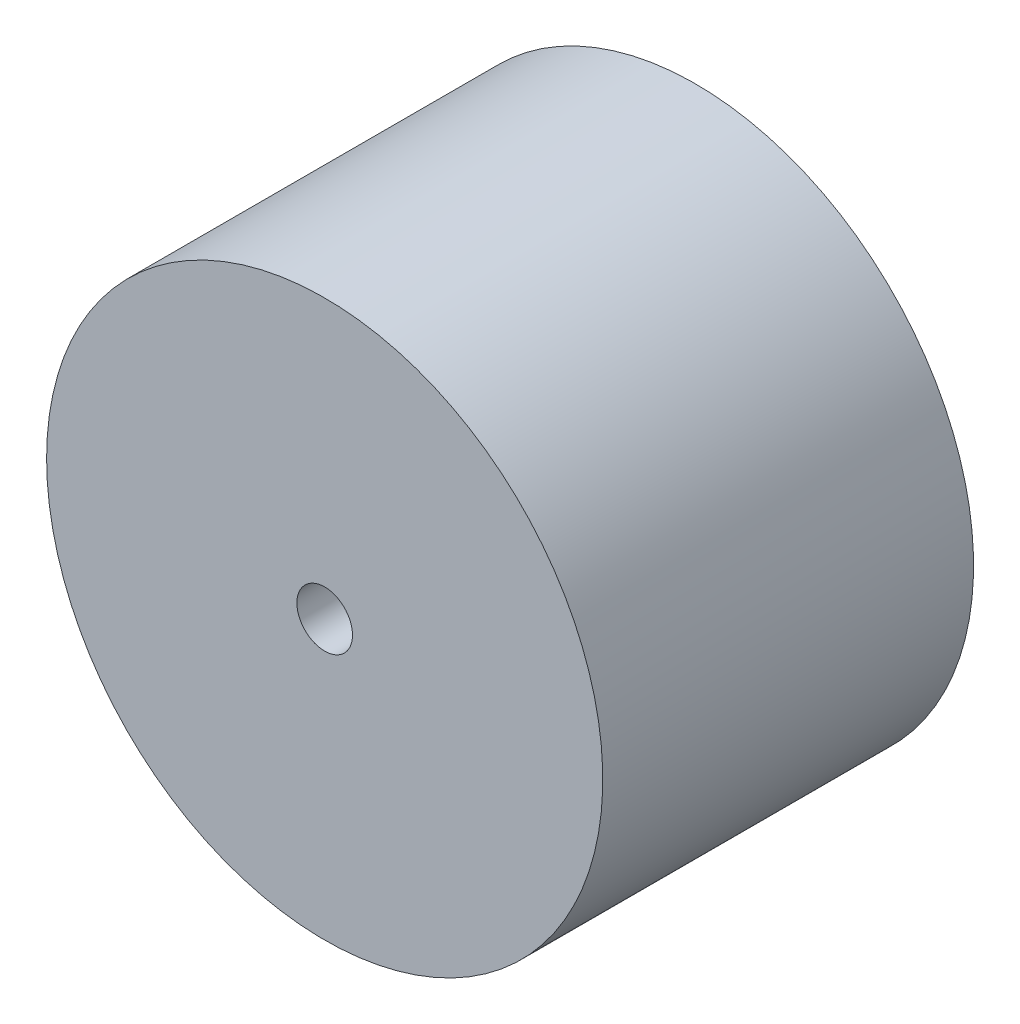
ISO-10303-21;
HEADER;
FILE_DESCRIPTION(('STEP AP214'),'2;1');
FILE_NAME('part.step','',(''),(''),'','','');
FILE_SCHEMA(('AUTOMOTIVE_DESIGN { 1 0 10303 214 1 1 1 1 }'));
ENDSEC;
DATA;
#1=APPLICATION_CONTEXT('core data for automotive mechanical design processes');
#2=APPLICATION_PROTOCOL_DEFINITION('international standard','automotive_design',2000,#1);
#3=PRODUCT_CONTEXT('',#1,'mechanical');
#4=PRODUCT('Part','Part','',(#3));
#5=PRODUCT_RELATED_PRODUCT_CATEGORY('part','',(#4));
#6=PRODUCT_DEFINITION_FORMATION('','',#4);
#7=PRODUCT_DEFINITION_CONTEXT('part definition',#1,'design');
#8=PRODUCT_DEFINITION('design','',#6,#7);
#9=PRODUCT_DEFINITION_SHAPE('','',#8);
#10=(LENGTH_UNIT() NAMED_UNIT(*) SI_UNIT(.MILLI.,.METRE.));
#11=(NAMED_UNIT(*) PLANE_ANGLE_UNIT() SI_UNIT($,.RADIAN.));
#12=(NAMED_UNIT(*) SI_UNIT($,.STERADIAN.) SOLID_ANGLE_UNIT());
#13=UNCERTAINTY_MEASURE_WITH_UNIT(LENGTH_MEASURE(1.E-05),#10,'distance_accuracy_value','');
#14=(GEOMETRIC_REPRESENTATION_CONTEXT(3) GLOBAL_UNCERTAINTY_ASSIGNED_CONTEXT((#13)) GLOBAL_UNIT_ASSIGNED_CONTEXT((#10,
#11,#12)) REPRESENTATION_CONTEXT('',''));
#15=CARTESIAN_POINT('',(0.,0.,0.));
#16=DIRECTION('',(0.,0.,1.));
#17=DIRECTION('',(1.,0.,0.));
#18=AXIS2_PLACEMENT_3D('',#15,#16,#17);
#19=CARTESIAN_POINT('',(0.,0.,25.));
#20=DIRECTION('',(0.,0.,-1.));
#21=DIRECTION('',(-1.,0.,0.));
#22=AXIS2_PLACEMENT_3D('',#19,#20,#21);
#23=CYLINDRICAL_SURFACE('',#22,1.5);
#24=CARTESIAN_POINT('',(0.,0.,0.));
#25=DIRECTION('',(0.,0.,-1.));
#26=DIRECTION('',(-1.,0.,0.));
#27=AXIS2_PLACEMENT_3D('',#24,#25,#26);
#28=CIRCLE('',#27,1.5);
#29=CARTESIAN_POINT('',(-1.5,0.,0.));
#30=VERTEX_POINT('',#29);
#31=EDGE_CURVE('E186',#30,#30,#28,.T.);
#32=ORIENTED_EDGE('',*,*,#31,.T.);
#33=EDGE_LOOP('',(#32));
#34=FACE_BOUND('',#33,.T.);
#35=CARTESIAN_POINT('',(0.,0.,16.));
#36=DIRECTION('',(0.,0.,1.));
#37=DIRECTION('',(1.,0.,0.));
#38=AXIS2_PLACEMENT_3D('',#35,#36,#37);
#39=CIRCLE('',#38,1.5);
#40=CARTESIAN_POINT('',(1.5,0.,16.));
#41=VERTEX_POINT('',#40);
#42=EDGE_CURVE('E177',#41,#41,#39,.T.);
#43=ORIENTED_EDGE('',*,*,#42,.T.);
#44=EDGE_LOOP('',(#43));
#45=FACE_BOUND('',#44,.T.);
#46=ADVANCED_FACE('F17',(#34,#45),#23,.F.);
#47=CARTESIAN_POINT('',(0.,0.,0.));
#48=DIRECTION('',(0.,0.,-1.));
#49=DIRECTION('',(0.,-1.,0.));
#50=AXIS2_PLACEMENT_3D('',#47,#48,#49);
#51=PLANE('',#50);
#52=CARTESIAN_POINT('',(10.3923048454133,-6.,0.));
#53=DIRECTION('',(0.,0.,-1.));
#54=DIRECTION('',(0.5,-0.866025403784439,0.));
#55=AXIS2_PLACEMENT_3D('',#52,#53,#54);
#56=CIRCLE('',#55,1.625);
#57=CARTESIAN_POINT('',(11.2048048454133,-7.40729128114971,0.));
#58=VERTEX_POINT('',#57);
#59=EDGE_CURVE('E11',#58,#58,#56,.T.);
#60=ORIENTED_EDGE('',*,*,#59,.T.);
#61=EDGE_LOOP('',(#60));
#62=FACE_BOUND('',#61,.T.);
#63=ADVANCED_FACE('F396',(#62),#51,.T.);
#64=CARTESIAN_POINT('',(10.3923048454133,-6.,-119.988123005821));
#65=DIRECTION('',(0.,0.,1.));
#66=DIRECTION('',(1.,0.,0.));
#67=AXIS2_PLACEMENT_3D('',#64,#65,#66);
#68=CYLINDRICAL_SURFACE('',#67,1.625);
#69=CARTESIAN_POINT('',(10.3923048454133,-6.,-4.));
#70=DIRECTION('',(0.,0.,-1.));
#71=DIRECTION('',(1.,0.,0.));
#72=AXIS2_PLACEMENT_3D('',#69,#70,#71);
#73=CIRCLE('',#72,1.625);
#74=CARTESIAN_POINT('',(12.0173048454133,-6.,-4.));
#75=VERTEX_POINT('',#74);
#76=EDGE_CURVE('E150',#75,#75,#73,.T.);
#77=ORIENTED_EDGE('',*,*,#76,.T.);
#78=EDGE_LOOP('',(#77));
#79=FACE_BOUND('',#78,.T.);
#80=ORIENTED_EDGE('',*,*,#59,.F.);
#81=EDGE_LOOP('',(#80));
#82=FACE_BOUND('',#81,.T.);
#83=ADVANCED_FACE('F391',(#79,#82),#68,.F.);
#84=CARTESIAN_POINT('',(0.,0.,0.));
#85=DIRECTION('',(0.,0.,-1.));
#86=DIRECTION('',(0.,-1.,0.));
#87=AXIS2_PLACEMENT_3D('',#84,#85,#86);
#88=PLANE('',#87);
#89=CARTESIAN_POINT('',(6.,-10.3923048454133,0.));
#90=DIRECTION('',(0.,0.,-1.));
#91=DIRECTION('',(0.5,-0.866025403784439,0.));
#92=AXIS2_PLACEMENT_3D('',#89,#90,#91);
#93=CIRCLE('',#92,2.);
#94=CARTESIAN_POINT('',(7.,-12.1243556529821,0.));
#95=VERTEX_POINT('',#94);
#96=EDGE_CURVE('E25',#95,#95,#93,.T.);
#97=ORIENTED_EDGE('',*,*,#96,.T.);
#98=EDGE_LOOP('',(#97));
#99=FACE_BOUND('',#98,.T.);
#100=ADVANCED_FACE('F385',(#99),#88,.T.);
#101=CARTESIAN_POINT('',(6.,-10.3923048454133,-119.988123005821));
#102=DIRECTION('',(0.,0.,1.));
#103=DIRECTION('',(1.,0.,0.));
#104=AXIS2_PLACEMENT_3D('',#101,#102,#103);
#105=CYLINDRICAL_SURFACE('',#104,2.);
#106=CARTESIAN_POINT('',(6.,-10.3923048454133,-4.));
#107=DIRECTION('',(0.,0.,-1.));
#108=DIRECTION('',(1.,0.,0.));
#109=AXIS2_PLACEMENT_3D('',#106,#107,#108);
#110=CIRCLE('',#109,2.);
#111=CARTESIAN_POINT('',(8.,-10.3923048454133,-4.));
#112=VERTEX_POINT('',#111);
#113=EDGE_CURVE('E151',#112,#112,#110,.T.);
#114=ORIENTED_EDGE('',*,*,#113,.T.);
#115=EDGE_LOOP('',(#114));
#116=FACE_BOUND('',#115,.T.);
#117=ORIENTED_EDGE('',*,*,#96,.F.);
#118=EDGE_LOOP('',(#117));
#119=FACE_BOUND('',#118,.T.);
#120=ADVANCED_FACE('F373',(#116,#119),#105,.F.);
#121=CARTESIAN_POINT('',(0.,0.,0.));
#122=DIRECTION('',(0.,0.,-1.));
#123=DIRECTION('',(0.,-1.,0.));
#124=AXIS2_PLACEMENT_3D('',#121,#122,#123);
#125=PLANE('',#124);
#126=CARTESIAN_POINT('',(0.,-12.,0.));
#127=DIRECTION('',(0.,0.,-1.));
#128=DIRECTION('',(0.5,-0.866025403784439,0.));
#129=AXIS2_PLACEMENT_3D('',#126,#127,#128);
#130=CIRCLE('',#129,1.625);
#131=CARTESIAN_POINT('',(0.8125,-13.4072912811497,0.));
#132=VERTEX_POINT('',#131);
#133=EDGE_CURVE('E196',#132,#132,#130,.T.);
#134=ORIENTED_EDGE('',*,*,#133,.T.);
#135=EDGE_LOOP('',(#134));
#136=FACE_BOUND('',#135,.T.);
#137=ADVANCED_FACE('F365',(#136),#125,.T.);
#138=CARTESIAN_POINT('',(0.,-12.,-119.988123005821));
#139=DIRECTION('',(0.,0.,1.));
#140=DIRECTION('',(1.,0.,0.));
#141=AXIS2_PLACEMENT_3D('',#138,#139,#140);
#142=CYLINDRICAL_SURFACE('',#141,1.625);
#143=CARTESIAN_POINT('',(0.,-12.,-4.));
#144=DIRECTION('',(0.,0.,-1.));
#145=DIRECTION('',(1.,0.,0.));
#146=AXIS2_PLACEMENT_3D('',#143,#144,#145);
#147=CIRCLE('',#146,1.625);
#148=CARTESIAN_POINT('',(1.625,-12.,-4.));
#149=VERTEX_POINT('',#148);
#150=EDGE_CURVE('E163',#149,#149,#147,.T.);
#151=ORIENTED_EDGE('',*,*,#150,.T.);
#152=EDGE_LOOP('',(#151));
#153=FACE_BOUND('',#152,.T.);
#154=ORIENTED_EDGE('',*,*,#133,.F.);
#155=EDGE_LOOP('',(#154));
#156=FACE_BOUND('',#155,.T.);
#157=ADVANCED_FACE('F354',(#153,#156),#142,.F.);
#158=CARTESIAN_POINT('',(0.,0.,0.));
#159=DIRECTION('',(0.,0.,-1.));
#160=DIRECTION('',(0.,-1.,0.));
#161=AXIS2_PLACEMENT_3D('',#158,#159,#160);
#162=PLANE('',#161);
#163=CARTESIAN_POINT('',(6.,10.3923048454133,0.));
#164=DIRECTION('',(0.,0.,-1.));
#165=DIRECTION('',(0.5,0.866025403784439,0.));
#166=AXIS2_PLACEMENT_3D('',#163,#164,#165);
#167=CIRCLE('',#166,2.);
#168=CARTESIAN_POINT('',(7.,12.1243556529821,0.));
#169=VERTEX_POINT('',#168);
#170=EDGE_CURVE('E193',#169,#169,#167,.T.);
#171=ORIENTED_EDGE('',*,*,#170,.T.);
#172=EDGE_LOOP('',(#171));
#173=FACE_BOUND('',#172,.T.);
#174=ADVANCED_FACE('F335',(#173),#162,.T.);
#175=CARTESIAN_POINT('',(6.,10.3923048454133,-119.988123005821));
#176=DIRECTION('',(0.,0.,1.));
#177=DIRECTION('',(1.,0.,0.));
#178=AXIS2_PLACEMENT_3D('',#175,#176,#177);
#179=CYLINDRICAL_SURFACE('',#178,2.);
#180=CARTESIAN_POINT('',(6.,10.3923048454133,-4.));
#181=DIRECTION('',(0.,0.,-1.));
#182=DIRECTION('',(1.,0.,0.));
#183=AXIS2_PLACEMENT_3D('',#180,#181,#182);
#184=CIRCLE('',#183,2.);
#185=CARTESIAN_POINT('',(8.,10.3923048454133,-4.));
#186=VERTEX_POINT('',#185);
#187=EDGE_CURVE('E129',#186,#186,#184,.T.);
#188=ORIENTED_EDGE('',*,*,#187,.T.);
#189=EDGE_LOOP('',(#188));
#190=FACE_BOUND('',#189,.T.);
#191=ORIENTED_EDGE('',*,*,#170,.F.);
#192=EDGE_LOOP('',(#191));
#193=FACE_BOUND('',#192,.T.);
#194=ADVANCED_FACE('F131',(#190,#193),#179,.F.);
#195=CARTESIAN_POINT('',(0.,0.,0.));
#196=DIRECTION('',(0.,0.,-1.));
#197=DIRECTION('',(0.,-1.,0.));
#198=AXIS2_PLACEMENT_3D('',#195,#196,#197);
#199=PLANE('',#198);
#200=CARTESIAN_POINT('',(10.3923048454133,6.,0.));
#201=DIRECTION('',(0.,0.,-1.));
#202=DIRECTION('',(0.5,0.866025403784439,0.));
#203=AXIS2_PLACEMENT_3D('',#200,#201,#202);
#204=CIRCLE('',#203,1.625);
#205=CARTESIAN_POINT('',(11.2048048454133,7.40729128114971,0.));
#206=VERTEX_POINT('',#205);
#207=EDGE_CURVE('E195',#206,#206,#204,.T.);
#208=ORIENTED_EDGE('',*,*,#207,.T.);
#209=EDGE_LOOP('',(#208));
#210=FACE_BOUND('',#209,.T.);
#211=ADVANCED_FACE('F332',(#210),#199,.T.);
#212=CARTESIAN_POINT('',(10.3923048454133,6.,-119.988123005821));
#213=DIRECTION('',(0.,0.,1.));
#214=DIRECTION('',(1.,0.,0.));
#215=AXIS2_PLACEMENT_3D('',#212,#213,#214);
#216=CYLINDRICAL_SURFACE('',#215,1.625);
#217=CARTESIAN_POINT('',(10.3923048454133,6.,-4.));
#218=DIRECTION('',(0.,0.,-1.));
#219=DIRECTION('',(1.,0.,0.));
#220=AXIS2_PLACEMENT_3D('',#217,#218,#219);
#221=CIRCLE('',#220,1.625);
#222=CARTESIAN_POINT('',(12.0173048454133,6.,-4.));
#223=VERTEX_POINT('',#222);
#224=EDGE_CURVE('E134',#223,#223,#221,.T.);
#225=ORIENTED_EDGE('',*,*,#224,.T.);
#226=EDGE_LOOP('',(#225));
#227=FACE_BOUND('',#226,.T.);
#228=ORIENTED_EDGE('',*,*,#207,.F.);
#229=EDGE_LOOP('',(#228));
#230=FACE_BOUND('',#229,.T.);
#231=ADVANCED_FACE('F272',(#227,#230),#216,.F.);
#232=CARTESIAN_POINT('',(0.,0.,0.));
#233=DIRECTION('',(0.,0.,-1.));
#234=DIRECTION('',(0.,-1.,0.));
#235=AXIS2_PLACEMENT_3D('',#232,#233,#234);
#236=PLANE('',#235);
#237=CARTESIAN_POINT('',(0.,12.,0.));
#238=DIRECTION('',(0.,0.,-1.));
#239=DIRECTION('',(0.5,0.866025403784439,0.));
#240=AXIS2_PLACEMENT_3D('',#237,#238,#239);
#241=CIRCLE('',#240,1.625);
#242=CARTESIAN_POINT('',(0.8125,13.4072912811497,0.));
#243=VERTEX_POINT('',#242);
#244=EDGE_CURVE('E188',#243,#243,#241,.T.);
#245=ORIENTED_EDGE('',*,*,#244,.T.);
#246=EDGE_LOOP('',(#245));
#247=FACE_BOUND('',#246,.T.);
#248=ADVANCED_FACE('F268',(#247),#236,.T.);
#249=CARTESIAN_POINT('',(0.,12.,-119.988123005821));
#250=DIRECTION('',(0.,0.,1.));
#251=DIRECTION('',(1.,0.,0.));
#252=AXIS2_PLACEMENT_3D('',#249,#250,#251);
#253=CYLINDRICAL_SURFACE('',#252,1.625);
#254=CARTESIAN_POINT('',(0.,12.,-4.));
#255=DIRECTION('',(0.,0.,-1.));
#256=DIRECTION('',(1.,0.,0.));
#257=AXIS2_PLACEMENT_3D('',#254,#255,#256);
#258=CIRCLE('',#257,1.625);
#259=CARTESIAN_POINT('',(1.625,12.,-4.));
#260=VERTEX_POINT('',#259);
#261=EDGE_CURVE('E138',#260,#260,#258,.T.);
#262=ORIENTED_EDGE('',*,*,#261,.T.);
#263=EDGE_LOOP('',(#262));
#264=FACE_BOUND('',#263,.T.);
#265=ORIENTED_EDGE('',*,*,#244,.F.);
#266=EDGE_LOOP('',(#265));
#267=FACE_BOUND('',#266,.T.);
#268=ADVANCED_FACE('F238',(#264,#267),#253,.F.);
#269=CARTESIAN_POINT('',(0.,0.,0.));
#270=DIRECTION('',(0.,0.,-1.));
#271=DIRECTION('',(0.,-1.,0.));
#272=AXIS2_PLACEMENT_3D('',#269,#270,#271);
#273=PLANE('',#272);
#274=CARTESIAN_POINT('',(0.,0.,0.));
#275=DIRECTION('',(0.,0.,-1.));
#276=DIRECTION('',(-1.,0.,0.));
#277=AXIS2_PLACEMENT_3D('',#274,#275,#276);
#278=CIRCLE('',#277,6.25);
#279=CARTESIAN_POINT('',(-6.25,0.,0.));
#280=VERTEX_POINT('',#279);
#281=EDGE_CURVE('E158',#280,#280,#278,.T.);
#282=ORIENTED_EDGE('',*,*,#281,.T.);
#283=EDGE_LOOP('',(#282));
#284=FACE_BOUND('',#283,.T.);
#285=ORIENTED_EDGE('',*,*,#31,.F.);
#286=EDGE_LOOP('',(#285));
#287=FACE_BOUND('',#286,.T.);
#288=ADVANCED_FACE('F235',(#284,#287),#273,.T.);
#289=CARTESIAN_POINT('',(0.,0.,-119.988123005821));
#290=DIRECTION('',(0.,0.,1.));
#291=DIRECTION('',(1.,0.,0.));
#292=AXIS2_PLACEMENT_3D('',#289,#290,#291);
#293=CYLINDRICAL_SURFACE('',#292,6.25);
#294=CARTESIAN_POINT('',(0.,0.,-4.));
#295=DIRECTION('',(0.,0.,-1.));
#296=DIRECTION('',(1.,0.,0.));
#297=AXIS2_PLACEMENT_3D('',#294,#295,#296);
#298=CIRCLE('',#297,6.25);
#299=CARTESIAN_POINT('',(6.25,0.,-4.));
#300=VERTEX_POINT('',#299);
#301=EDGE_CURVE('E152',#300,#300,#298,.T.);
#302=ORIENTED_EDGE('',*,*,#301,.T.);
#303=EDGE_LOOP('',(#302));
#304=FACE_BOUND('',#303,.T.);
#305=ORIENTED_EDGE('',*,*,#281,.F.);
#306=EDGE_LOOP('',(#305));
#307=FACE_BOUND('',#306,.T.);
#308=ADVANCED_FACE('F236',(#304,#307),#293,.F.);
#309=CARTESIAN_POINT('',(0.,0.,0.));
#310=DIRECTION('',(0.,0.,-1.));
#311=DIRECTION('',(0.,-1.,0.));
#312=AXIS2_PLACEMENT_3D('',#309,#310,#311);
#313=PLANE('',#312);
#314=CARTESIAN_POINT('',(-10.3923048454133,6.,0.));
#315=DIRECTION('',(0.,0.,-1.));
#316=DIRECTION('',(-1.,0.,0.));
#317=AXIS2_PLACEMENT_3D('',#314,#315,#316);
#318=CIRCLE('',#317,1.625);
#319=CARTESIAN_POINT('',(-12.0173048454133,6.,0.));
#320=VERTEX_POINT('',#319);
#321=EDGE_CURVE('E154',#320,#320,#318,.T.);
#322=ORIENTED_EDGE('',*,*,#321,.T.);
#323=EDGE_LOOP('',(#322));
#324=FACE_BOUND('',#323,.T.);
#325=ADVANCED_FACE('F299',(#324),#313,.T.);
#326=CARTESIAN_POINT('',(-10.3923048454133,6.,-119.988123005821));
#327=DIRECTION('',(0.,0.,1.));
#328=DIRECTION('',(1.,0.,0.));
#329=AXIS2_PLACEMENT_3D('',#326,#327,#328);
#330=CYLINDRICAL_SURFACE('',#329,1.625);
#331=CARTESIAN_POINT('',(-10.3923048454133,6.,-4.));
#332=DIRECTION('',(0.,0.,-1.));
#333=DIRECTION('',(1.,0.,0.));
#334=AXIS2_PLACEMENT_3D('',#331,#332,#333);
#335=CIRCLE('',#334,1.625);
#336=CARTESIAN_POINT('',(-8.76730484541326,6.,-4.));
#337=VERTEX_POINT('',#336);
#338=EDGE_CURVE('E144',#337,#337,#335,.T.);
#339=ORIENTED_EDGE('',*,*,#338,.T.);
#340=EDGE_LOOP('',(#339));
#341=FACE_BOUND('',#340,.T.);
#342=ORIENTED_EDGE('',*,*,#321,.F.);
#343=EDGE_LOOP('',(#342));
#344=FACE_BOUND('',#343,.T.);
#345=ADVANCED_FACE('F295',(#341,#344),#330,.F.);
#346=CARTESIAN_POINT('',(0.,0.,0.));
#347=DIRECTION('',(0.,0.,-1.));
#348=DIRECTION('',(0.,-1.,0.));
#349=AXIS2_PLACEMENT_3D('',#346,#347,#348);
#350=PLANE('',#349);
#351=CARTESIAN_POINT('',(-12.,0.,0.));
#352=DIRECTION('',(0.,0.,-1.));
#353=DIRECTION('',(-1.,0.,0.));
#354=AXIS2_PLACEMENT_3D('',#351,#352,#353);
#355=CIRCLE('',#354,2.);
#356=CARTESIAN_POINT('',(-14.,0.,0.));
#357=VERTEX_POINT('',#356);
#358=EDGE_CURVE('E157',#357,#357,#355,.T.);
#359=ORIENTED_EDGE('',*,*,#358,.T.);
#360=EDGE_LOOP('',(#359));
#361=FACE_BOUND('',#360,.T.);
#362=ADVANCED_FACE('F282',(#361),#350,.T.);
#363=CARTESIAN_POINT('',(-12.,0.,-119.988123005821));
#364=DIRECTION('',(0.,0.,1.));
#365=DIRECTION('',(1.,0.,0.));
#366=AXIS2_PLACEMENT_3D('',#363,#364,#365);
#367=CYLINDRICAL_SURFACE('',#366,2.);
#368=CARTESIAN_POINT('',(-12.,0.,-4.));
#369=DIRECTION('',(0.,0.,-1.));
#370=DIRECTION('',(1.,0.,0.));
#371=AXIS2_PLACEMENT_3D('',#368,#369,#370);
#372=CIRCLE('',#371,2.);
#373=CARTESIAN_POINT('',(-10.,0.,-4.));
#374=VERTEX_POINT('',#373);
#375=EDGE_CURVE('E141',#374,#374,#372,.T.);
#376=ORIENTED_EDGE('',*,*,#375,.T.);
#377=EDGE_LOOP('',(#376));
#378=FACE_BOUND('',#377,.T.);
#379=ORIENTED_EDGE('',*,*,#358,.F.);
#380=EDGE_LOOP('',(#379));
#381=FACE_BOUND('',#380,.T.);
#382=ADVANCED_FACE('F223',(#378,#381),#367,.F.);
#383=CARTESIAN_POINT('',(0.,0.,0.));
#384=DIRECTION('',(0.,0.,-1.));
#385=DIRECTION('',(0.,-1.,0.));
#386=AXIS2_PLACEMENT_3D('',#383,#384,#385);
#387=PLANE('',#386);
#388=CARTESIAN_POINT('',(-10.3923048454133,-6.,0.));
#389=DIRECTION('',(0.,0.,-1.));
#390=DIRECTION('',(-1.,0.,0.));
#391=AXIS2_PLACEMENT_3D('',#388,#389,#390);
#392=CIRCLE('',#391,1.625);
#393=CARTESIAN_POINT('',(-12.0173048454133,-6.,0.));
#394=VERTEX_POINT('',#393);
#395=EDGE_CURVE('E176',#394,#394,#392,.T.);
#396=ORIENTED_EDGE('',*,*,#395,.T.);
#397=EDGE_LOOP('',(#396));
#398=FACE_BOUND('',#397,.T.);
#399=ADVANCED_FACE('F218',(#398),#387,.T.);
#400=CARTESIAN_POINT('',(-10.3923048454133,-6.,-119.988123005821));
#401=DIRECTION('',(0.,0.,1.));
#402=DIRECTION('',(1.,0.,0.));
#403=AXIS2_PLACEMENT_3D('',#400,#401,#402);
#404=CYLINDRICAL_SURFACE('',#403,1.625);
#405=CARTESIAN_POINT('',(-10.3923048454133,-6.,-4.));
#406=DIRECTION('',(0.,0.,-1.));
#407=DIRECTION('',(1.,0.,0.));
#408=AXIS2_PLACEMENT_3D('',#405,#406,#407);
#409=CIRCLE('',#408,1.625);
#410=CARTESIAN_POINT('',(-8.76730484541326,-6.,-4.));
#411=VERTEX_POINT('',#410);
#412=EDGE_CURVE('E145',#411,#411,#409,.T.);
#413=ORIENTED_EDGE('',*,*,#412,.T.);
#414=EDGE_LOOP('',(#413));
#415=FACE_BOUND('',#414,.T.);
#416=ORIENTED_EDGE('',*,*,#395,.F.);
#417=EDGE_LOOP('',(#416));
#418=FACE_BOUND('',#417,.T.);
#419=ADVANCED_FACE('F221',(#415,#418),#404,.F.);
#420=CARTESIAN_POINT('',(-7.5,0.,16.));
#421=DIRECTION('',(0.,0.,1.));
#422=DIRECTION('',(1.,0.,0.));
#423=AXIS2_PLACEMENT_3D('',#420,#421,#422);
#424=PLANE('',#423);
#425=CARTESIAN_POINT('',(0.,0.,16.));
#426=DIRECTION('',(0.,0.,-1.));
#427=DIRECTION('',(-1.,0.,0.));
#428=AXIS2_PLACEMENT_3D('',#425,#426,#427);
#429=CIRCLE('',#428,15.);
#430=CARTESIAN_POINT('',(-15.,0.,16.));
#431=VERTEX_POINT('',#430);
#432=EDGE_CURVE('E147',#431,#431,#429,.T.);
#433=ORIENTED_EDGE('',*,*,#432,.F.);
#434=EDGE_LOOP('',(#433));
#435=FACE_BOUND('',#434,.T.);
#436=ORIENTED_EDGE('',*,*,#42,.F.);
#437=EDGE_LOOP('',(#436));
#438=FACE_BOUND('',#437,.T.);
#439=ADVANCED_FACE('F249',(#435,#438),#424,.T.);
#440=CARTESIAN_POINT('',(0.,0.,18.75));
#441=DIRECTION('',(0.,0.,-1.));
#442=DIRECTION('',(-1.,0.,0.));
#443=AXIS2_PLACEMENT_3D('',#440,#441,#442);
#444=CYLINDRICAL_SURFACE('',#443,15.);
#445=ORIENTED_EDGE('',*,*,#432,.T.);
#446=EDGE_LOOP('',(#445));
#447=FACE_BOUND('',#446,.T.);
#448=CARTESIAN_POINT('',(0.,0.,-4.));
#449=DIRECTION('',(0.,0.,-1.));
#450=DIRECTION('',(-1.,0.,0.));
#451=AXIS2_PLACEMENT_3D('',#448,#449,#450);
#452=CIRCLE('',#451,15.);
#453=CARTESIAN_POINT('',(-15.,0.,-4.));
#454=VERTEX_POINT('',#453);
#455=EDGE_CURVE('E166',#454,#454,#452,.T.);
#456=ORIENTED_EDGE('',*,*,#455,.F.);
#457=EDGE_LOOP('',(#456));
#458=FACE_BOUND('',#457,.T.);
#459=ADVANCED_FACE('F215',(#447,#458),#444,.T.);
#460=CARTESIAN_POINT('',(-7.5,0.,-4.));
#461=DIRECTION('',(0.,0.,1.));
#462=DIRECTION('',(1.,0.,0.));
#463=AXIS2_PLACEMENT_3D('',#460,#461,#462);
#464=PLANE('',#463);
#465=ORIENTED_EDGE('',*,*,#76,.F.);
#466=EDGE_LOOP('',(#465));
#467=FACE_BOUND('',#466,.T.);
#468=ORIENTED_EDGE('',*,*,#113,.F.);
#469=EDGE_LOOP('',(#468));
#470=FACE_BOUND('',#469,.T.);
#471=ORIENTED_EDGE('',*,*,#150,.F.);
#472=EDGE_LOOP('',(#471));
#473=FACE_BOUND('',#472,.T.);
#474=ORIENTED_EDGE('',*,*,#455,.T.);
#475=EDGE_LOOP('',(#474));
#476=FACE_BOUND('',#475,.T.);
#477=ORIENTED_EDGE('',*,*,#412,.F.);
#478=EDGE_LOOP('',(#477));
#479=FACE_BOUND('',#478,.T.);
#480=ORIENTED_EDGE('',*,*,#375,.F.);
#481=EDGE_LOOP('',(#480));
#482=FACE_BOUND('',#481,.T.);
#483=ORIENTED_EDGE('',*,*,#338,.F.);
#484=EDGE_LOOP('',(#483));
#485=FACE_BOUND('',#484,.T.);
#486=ORIENTED_EDGE('',*,*,#301,.F.);
#487=EDGE_LOOP('',(#486));
#488=FACE_BOUND('',#487,.T.);
#489=ORIENTED_EDGE('',*,*,#261,.F.);
#490=EDGE_LOOP('',(#489));
#491=FACE_BOUND('',#490,.T.);
#492=ORIENTED_EDGE('',*,*,#224,.F.);
#493=EDGE_LOOP('',(#492));
#494=FACE_BOUND('',#493,.T.);
#495=ORIENTED_EDGE('',*,*,#187,.F.);
#496=EDGE_LOOP('',(#495));
#497=FACE_BOUND('',#496,.T.);
#498=ADVANCED_FACE('F210',(#467,#470,#473,#476,#479,#482,#485,#488,#491,#494,#497),#464,.F.);
#499=CLOSED_SHELL('',(#46,#63,#83,#100,#120,#137,#157,#174,#194,#211,#231,#248,#268,#288,#308,
#325,#345,#362,#382,#399,#419,#439,#459,#498));
#500=MANIFOLD_SOLID_BREP('B1',#499);
#501=ADVANCED_BREP_SHAPE_REPRESENTATION('',(#18,#500),#14);
#502=SHAPE_DEFINITION_REPRESENTATION(#9,#501);
ENDSEC;
END-ISO-10303-21;
